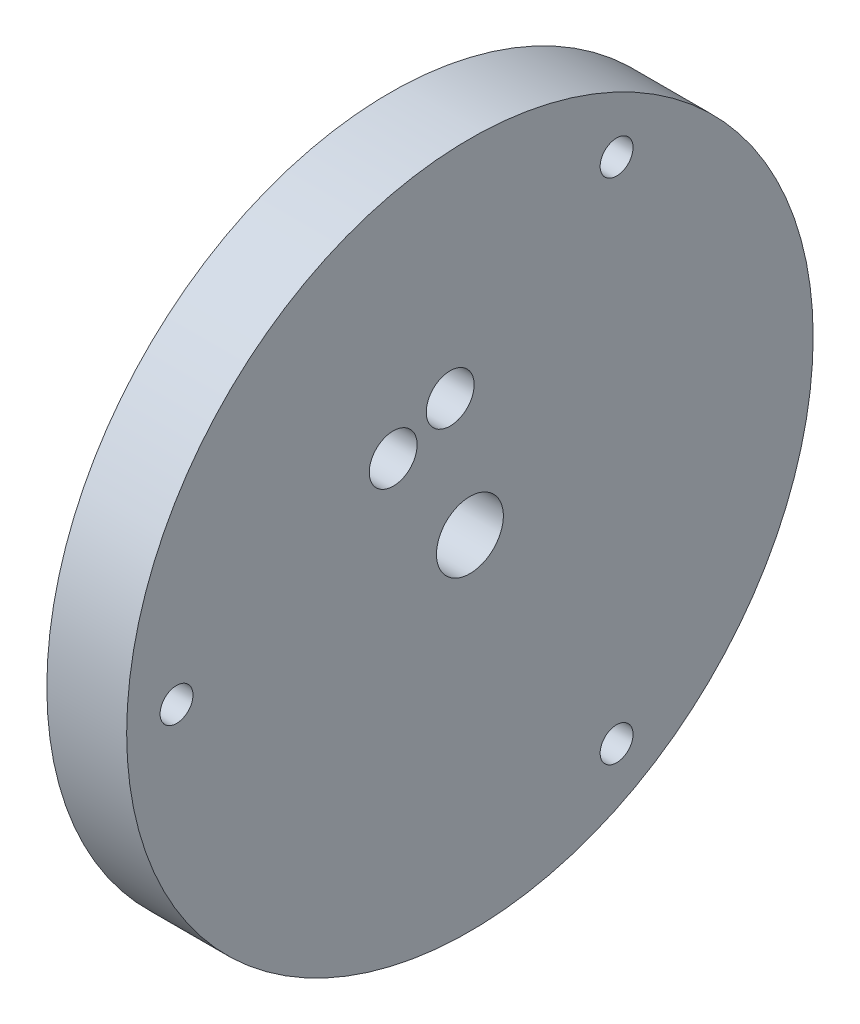
ISO-10303-21;
HEADER;
FILE_DESCRIPTION(('STEP AP214'),'2;1');
FILE_NAME('part.step','',(''),(''),'','','');
FILE_SCHEMA(('AUTOMOTIVE_DESIGN { 1 0 10303 214 1 1 1 1 }'));
ENDSEC;
DATA;
#1=APPLICATION_CONTEXT('core data for automotive mechanical design processes');
#2=APPLICATION_PROTOCOL_DEFINITION('international standard','automotive_design',2000,#1);
#3=PRODUCT_CONTEXT('',#1,'mechanical');
#4=PRODUCT('Part','Part','',(#3));
#5=PRODUCT_RELATED_PRODUCT_CATEGORY('part','',(#4));
#6=PRODUCT_DEFINITION_FORMATION('','',#4);
#7=PRODUCT_DEFINITION_CONTEXT('part definition',#1,'design');
#8=PRODUCT_DEFINITION('design','',#6,#7);
#9=PRODUCT_DEFINITION_SHAPE('','',#8);
#10=(LENGTH_UNIT() NAMED_UNIT(*) SI_UNIT(.MILLI.,.METRE.));
#11=(NAMED_UNIT(*) PLANE_ANGLE_UNIT() SI_UNIT($,.RADIAN.));
#12=(NAMED_UNIT(*) SI_UNIT($,.STERADIAN.) SOLID_ANGLE_UNIT());
#13=UNCERTAINTY_MEASURE_WITH_UNIT(LENGTH_MEASURE(1.E-05),#10,'distance_accuracy_value','');
#14=(GEOMETRIC_REPRESENTATION_CONTEXT(3) GLOBAL_UNCERTAINTY_ASSIGNED_CONTEXT((#13)) GLOBAL_UNIT_ASSIGNED_CONTEXT((#10,
#11,#12)) REPRESENTATION_CONTEXT('',''));
#15=CARTESIAN_POINT('',(0.,0.,0.));
#16=DIRECTION('',(0.,0.,1.));
#17=DIRECTION('',(1.,0.,0.));
#18=AXIS2_PLACEMENT_3D('',#15,#16,#17);
#19=CARTESIAN_POINT('',(148.7,34.4,0.));
#20=DIRECTION('',(1.,0.,0.));
#21=DIRECTION('',(0.,0.,-1.));
#22=AXIS2_PLACEMENT_3D('',#19,#20,#21);
#23=PLANE('',#22);
#24=CARTESIAN_POINT('',(148.7,25.4611468712625,-14.7));
#25=DIRECTION('',(1.,0.,0.));
#26=DIRECTION('',(0.,0.,-1.));
#27=AXIS2_PLACEMENT_3D('',#24,#25,#26);
#28=CIRCLE('',#27,1.65);
#29=CARTESIAN_POINT('',(148.7,25.4611468712625,-16.35));
#30=VERTEX_POINT('',#29);
#31=EDGE_CURVE('E50',#30,#30,#28,.F.);
#32=ORIENTED_EDGE('',*,*,#31,.F.);
#33=EDGE_LOOP('',(#32));
#34=FACE_BOUND('',#33,.T.);
#35=CARTESIAN_POINT('',(148.7,-25.4611468712625,-14.7));
#36=DIRECTION('',(1.,0.,0.));
#37=DIRECTION('',(0.,0.,-1.));
#38=AXIS2_PLACEMENT_3D('',#35,#36,#37);
#39=CIRCLE('',#38,1.65);
#40=CARTESIAN_POINT('',(148.7,-25.4611468712625,-16.35));
#41=VERTEX_POINT('',#40);
#42=EDGE_CURVE('E53',#41,#41,#39,.F.);
#43=ORIENTED_EDGE('',*,*,#42,.F.);
#44=EDGE_LOOP('',(#43));
#45=FACE_BOUND('',#44,.T.);
#46=CARTESIAN_POINT('',(148.7,0.,29.4));
#47=DIRECTION('',(1.,0.,0.));
#48=DIRECTION('',(0.,0.,-1.));
#49=AXIS2_PLACEMENT_3D('',#46,#47,#48);
#50=CIRCLE('',#49,1.65);
#51=CARTESIAN_POINT('',(148.7,0.,27.75));
#52=VERTEX_POINT('',#51);
#53=EDGE_CURVE('E56',#52,#52,#50,.F.);
#54=ORIENTED_EDGE('',*,*,#53,.F.);
#55=EDGE_LOOP('',(#54));
#56=FACE_BOUND('',#55,.T.);
#57=CARTESIAN_POINT('',(148.7,10.4836474229945,7.68720604058077));
#58=DIRECTION('',(1.,0.,0.));
#59=DIRECTION('',(0.,0.,-1.));
#60=AXIS2_PLACEMENT_3D('',#57,#58,#59);
#61=CIRCLE('',#60,2.4);
#62=CARTESIAN_POINT('',(148.7,10.4836474229945,5.28720604058077));
#63=VERTEX_POINT('',#62);
#64=EDGE_CURVE('E59',#63,#63,#61,.F.);
#65=ORIENTED_EDGE('',*,*,#64,.F.);
#66=EDGE_LOOP('',(#65));
#67=FACE_BOUND('',#66,.T.);
#68=CARTESIAN_POINT('',(148.7,12.8487337040411,1.97738266469541));
#69=DIRECTION('',(1.,0.,0.));
#70=DIRECTION('',(0.,0.,-1.));
#71=AXIS2_PLACEMENT_3D('',#68,#69,#70);
#72=CIRCLE('',#71,2.4);
#73=CARTESIAN_POINT('',(148.7,12.8487337040411,-0.422617335304591));
#74=VERTEX_POINT('',#73);
#75=EDGE_CURVE('E62',#74,#74,#72,.F.);
#76=ORIENTED_EDGE('',*,*,#75,.F.);
#77=EDGE_LOOP('',(#76));
#78=FACE_BOUND('',#77,.T.);
#79=CARTESIAN_POINT('',(148.7,0.,0.));
#80=DIRECTION('',(-1.,0.,0.));
#81=DIRECTION('',(0.,0.,1.));
#82=AXIS2_PLACEMENT_3D('',#79,#80,#81);
#83=CIRCLE('',#82,3.35);
#84=CARTESIAN_POINT('',(148.7,0.,3.35));
#85=VERTEX_POINT('',#84);
#86=EDGE_CURVE('E10',#85,#85,#83,.T.);
#87=ORIENTED_EDGE('',*,*,#86,.F.);
#88=EDGE_LOOP('',(#87));
#89=FACE_BOUND('',#88,.T.);
#90=CARTESIAN_POINT('',(148.7,0.,0.));
#91=DIRECTION('',(-1.,0.,0.));
#92=DIRECTION('',(0.,0.,1.));
#93=AXIS2_PLACEMENT_3D('',#90,#91,#92);
#94=CIRCLE('',#93,34.4);
#95=CARTESIAN_POINT('',(148.7,0.,34.4));
#96=VERTEX_POINT('',#95);
#97=EDGE_CURVE('E45',#96,#96,#94,.T.);
#98=ORIENTED_EDGE('',*,*,#97,.T.);
#99=EDGE_LOOP('',(#98));
#100=FACE_BOUND('',#99,.T.);
#101=ADVANCED_FACE('F31',(#34,#45,#56,#67,#78,#89,#100),#23,.F.);
#102=CARTESIAN_POINT('',(-110.,0.,0.));
#103=DIRECTION('',(-1.,0.,0.));
#104=DIRECTION('',(0.,0.,1.));
#105=AXIS2_PLACEMENT_3D('',#102,#103,#104);
#106=CYLINDRICAL_SURFACE('',#105,3.35);
#107=CARTESIAN_POINT('',(156.7,0.,0.));
#108=DIRECTION('',(-1.,0.,0.));
#109=DIRECTION('',(0.,0.,1.));
#110=AXIS2_PLACEMENT_3D('',#107,#108,#109);
#111=CIRCLE('',#110,3.35);
#112=CARTESIAN_POINT('',(156.7,0.,3.35));
#113=VERTEX_POINT('',#112);
#114=EDGE_CURVE('E37',#113,#113,#111,.T.);
#115=ORIENTED_EDGE('',*,*,#114,.F.);
#116=EDGE_LOOP('',(#115));
#117=FACE_BOUND('',#116,.T.);
#118=ORIENTED_EDGE('',*,*,#86,.T.);
#119=EDGE_LOOP('',(#118));
#120=FACE_BOUND('',#119,.T.);
#121=ADVANCED_FACE('F88',(#117,#120),#106,.F.);
#122=CARTESIAN_POINT('',(156.7,3.35,0.));
#123=DIRECTION('',(-1.,0.,0.));
#124=DIRECTION('',(0.,0.,1.));
#125=AXIS2_PLACEMENT_3D('',#122,#123,#124);
#126=PLANE('',#125);
#127=CARTESIAN_POINT('',(156.7,25.4611468712625,-14.7));
#128=DIRECTION('',(1.,0.,0.));
#129=DIRECTION('',(0.,0.,-1.));
#130=AXIS2_PLACEMENT_3D('',#127,#128,#129);
#131=CIRCLE('',#130,1.65);
#132=CARTESIAN_POINT('',(156.7,25.4611468712625,-16.35));
#133=VERTEX_POINT('',#132);
#134=EDGE_CURVE('E69',#133,#133,#131,.T.);
#135=ORIENTED_EDGE('',*,*,#134,.F.);
#136=EDGE_LOOP('',(#135));
#137=FACE_BOUND('',#136,.T.);
#138=CARTESIAN_POINT('',(156.7,-25.4611468712625,-14.7));
#139=DIRECTION('',(1.,0.,0.));
#140=DIRECTION('',(0.,0.,-1.));
#141=AXIS2_PLACEMENT_3D('',#138,#139,#140);
#142=CIRCLE('',#141,1.65);
#143=CARTESIAN_POINT('',(156.7,-25.4611468712625,-16.35));
#144=VERTEX_POINT('',#143);
#145=EDGE_CURVE('E72',#144,#144,#142,.T.);
#146=ORIENTED_EDGE('',*,*,#145,.F.);
#147=EDGE_LOOP('',(#146));
#148=FACE_BOUND('',#147,.T.);
#149=CARTESIAN_POINT('',(156.7,0.,29.4));
#150=DIRECTION('',(1.,0.,0.));
#151=DIRECTION('',(0.,0.,-1.));
#152=AXIS2_PLACEMENT_3D('',#149,#150,#151);
#153=CIRCLE('',#152,1.65);
#154=CARTESIAN_POINT('',(156.7,0.,27.75));
#155=VERTEX_POINT('',#154);
#156=EDGE_CURVE('E75',#155,#155,#153,.T.);
#157=ORIENTED_EDGE('',*,*,#156,.F.);
#158=EDGE_LOOP('',(#157));
#159=FACE_BOUND('',#158,.T.);
#160=CARTESIAN_POINT('',(156.7,10.4836474229945,7.68720604058077));
#161=DIRECTION('',(1.,0.,0.));
#162=DIRECTION('',(0.,0.,-1.));
#163=AXIS2_PLACEMENT_3D('',#160,#161,#162);
#164=CIRCLE('',#163,2.4);
#165=CARTESIAN_POINT('',(156.7,10.4836474229945,5.28720604058077));
#166=VERTEX_POINT('',#165);
#167=EDGE_CURVE('E68',#166,#166,#164,.T.);
#168=ORIENTED_EDGE('',*,*,#167,.F.);
#169=EDGE_LOOP('',(#168));
#170=FACE_BOUND('',#169,.T.);
#171=CARTESIAN_POINT('',(156.7,12.8487337040411,1.97738266469541));
#172=DIRECTION('',(1.,0.,0.));
#173=DIRECTION('',(0.,0.,-1.));
#174=AXIS2_PLACEMENT_3D('',#171,#172,#173);
#175=CIRCLE('',#174,2.4);
#176=CARTESIAN_POINT('',(156.7,12.8487337040411,-0.422617335304591));
#177=VERTEX_POINT('',#176);
#178=EDGE_CURVE('E65',#177,#177,#175,.T.);
#179=ORIENTED_EDGE('',*,*,#178,.F.);
#180=EDGE_LOOP('',(#179));
#181=FACE_BOUND('',#180,.T.);
#182=CARTESIAN_POINT('',(156.7,0.,0.));
#183=DIRECTION('',(-1.,0.,0.));
#184=DIRECTION('',(0.,0.,1.));
#185=AXIS2_PLACEMENT_3D('',#182,#183,#184);
#186=CIRCLE('',#185,34.4);
#187=CARTESIAN_POINT('',(156.7,0.,34.4));
#188=VERTEX_POINT('',#187);
#189=EDGE_CURVE('E41',#188,#188,#186,.T.);
#190=ORIENTED_EDGE('',*,*,#189,.F.);
#191=EDGE_LOOP('',(#190));
#192=FACE_BOUND('',#191,.T.);
#193=ORIENTED_EDGE('',*,*,#114,.T.);
#194=EDGE_LOOP('',(#193));
#195=FACE_BOUND('',#194,.T.);
#196=ADVANCED_FACE('F84',(#137,#148,#159,#170,#181,#192,#195),#126,.F.);
#197=CARTESIAN_POINT('',(-110.,0.,0.));
#198=DIRECTION('',(-1.,0.,0.));
#199=DIRECTION('',(0.,0.,1.));
#200=AXIS2_PLACEMENT_3D('',#197,#198,#199);
#201=CYLINDRICAL_SURFACE('',#200,34.4);
#202=ORIENTED_EDGE('',*,*,#97,.F.);
#203=EDGE_LOOP('',(#202));
#204=FACE_BOUND('',#203,.T.);
#205=ORIENTED_EDGE('',*,*,#189,.T.);
#206=EDGE_LOOP('',(#205));
#207=FACE_BOUND('',#206,.T.);
#208=ADVANCED_FACE('F87',(#204,#207),#201,.T.);
#209=CARTESIAN_POINT('',(148.7,12.8487337040411,1.97738266469541));
#210=DIRECTION('',(-1.,0.,0.));
#211=DIRECTION('',(0.,0.,1.));
#212=AXIS2_PLACEMENT_3D('',#209,#210,#211);
#213=CYLINDRICAL_SURFACE('',#212,2.4);
#214=ORIENTED_EDGE('',*,*,#178,.T.);
#215=EDGE_LOOP('',(#214));
#216=FACE_BOUND('',#215,.T.);
#217=ORIENTED_EDGE('',*,*,#75,.T.);
#218=EDGE_LOOP('',(#217));
#219=FACE_BOUND('',#218,.T.);
#220=ADVANCED_FACE('F96',(#216,#219),#213,.F.);
#221=CARTESIAN_POINT('',(148.7,10.4836474229945,7.68720604058077));
#222=DIRECTION('',(-1.,0.,0.));
#223=DIRECTION('',(0.,0.,1.));
#224=AXIS2_PLACEMENT_3D('',#221,#222,#223);
#225=CYLINDRICAL_SURFACE('',#224,2.4);
#226=ORIENTED_EDGE('',*,*,#167,.T.);
#227=EDGE_LOOP('',(#226));
#228=FACE_BOUND('',#227,.T.);
#229=ORIENTED_EDGE('',*,*,#64,.T.);
#230=EDGE_LOOP('',(#229));
#231=FACE_BOUND('',#230,.T.);
#232=ADVANCED_FACE('F81',(#228,#231),#225,.F.);
#233=CARTESIAN_POINT('',(148.7,0.,29.4));
#234=DIRECTION('',(-1.,0.,0.));
#235=DIRECTION('',(0.,0.,1.));
#236=AXIS2_PLACEMENT_3D('',#233,#234,#235);
#237=CYLINDRICAL_SURFACE('',#236,1.65);
#238=ORIENTED_EDGE('',*,*,#156,.T.);
#239=EDGE_LOOP('',(#238));
#240=FACE_BOUND('',#239,.T.);
#241=ORIENTED_EDGE('',*,*,#53,.T.);
#242=EDGE_LOOP('',(#241));
#243=FACE_BOUND('',#242,.T.);
#244=ADVANCED_FACE('F124',(#240,#243),#237,.F.);
#245=CARTESIAN_POINT('',(148.7,-25.4611468712625,-14.7));
#246=DIRECTION('',(-1.,0.,0.));
#247=DIRECTION('',(0.,0.,1.));
#248=AXIS2_PLACEMENT_3D('',#245,#246,#247);
#249=CYLINDRICAL_SURFACE('',#248,1.65);
#250=ORIENTED_EDGE('',*,*,#145,.T.);
#251=EDGE_LOOP('',(#250));
#252=FACE_BOUND('',#251,.T.);
#253=ORIENTED_EDGE('',*,*,#42,.T.);
#254=EDGE_LOOP('',(#253));
#255=FACE_BOUND('',#254,.T.);
#256=ADVANCED_FACE('F129',(#252,#255),#249,.F.);
#257=CARTESIAN_POINT('',(148.7,25.4611468712625,-14.7));
#258=DIRECTION('',(-1.,0.,0.));
#259=DIRECTION('',(0.,0.,1.));
#260=AXIS2_PLACEMENT_3D('',#257,#258,#259);
#261=CYLINDRICAL_SURFACE('',#260,1.65);
#262=ORIENTED_EDGE('',*,*,#134,.T.);
#263=EDGE_LOOP('',(#262));
#264=FACE_BOUND('',#263,.T.);
#265=ORIENTED_EDGE('',*,*,#31,.T.);
#266=EDGE_LOOP('',(#265));
#267=FACE_BOUND('',#266,.T.);
#268=ADVANCED_FACE('F135',(#264,#267),#261,.F.);
#269=CLOSED_SHELL('',(#101,#121,#196,#208,#220,#232,#244,#256,#268));
#270=MANIFOLD_SOLID_BREP('B2',#269);
#271=ADVANCED_BREP_SHAPE_REPRESENTATION('',(#18,#270),#14);
#272=SHAPE_DEFINITION_REPRESENTATION(#9,#271);
ENDSEC;
END-ISO-10303-21;
